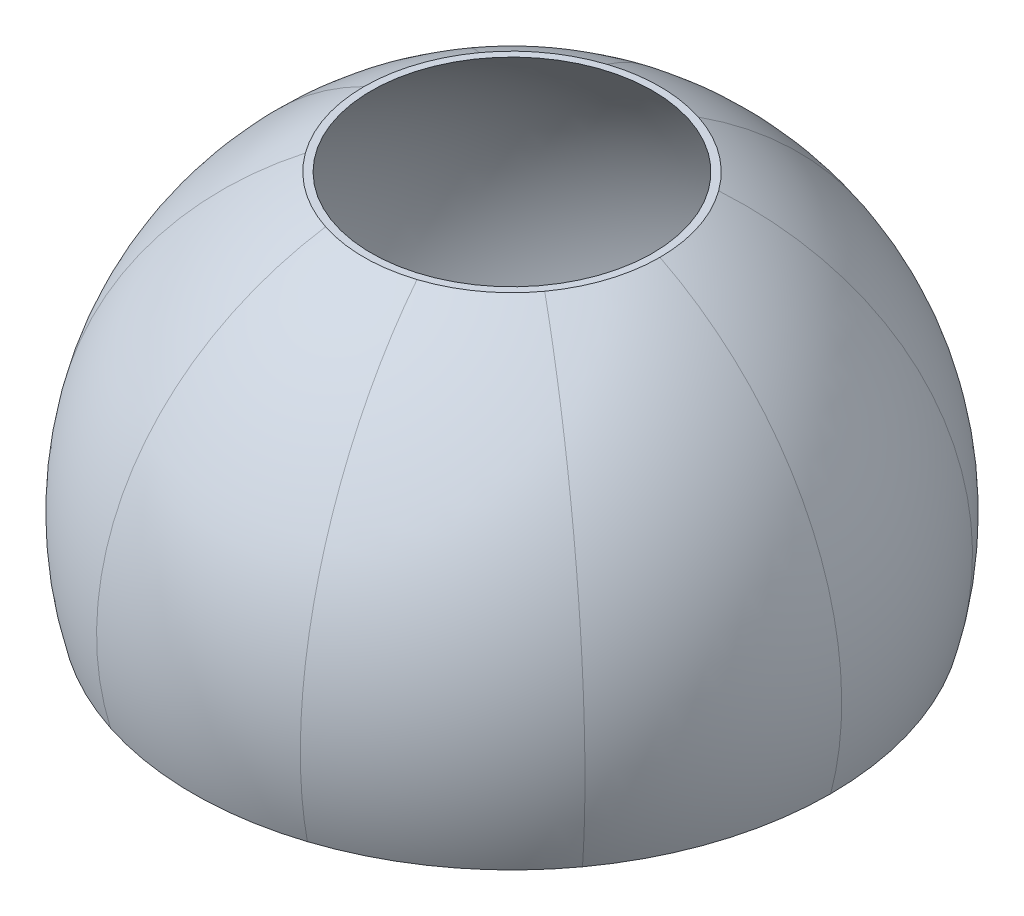
ISO-10303-21;
HEADER;
FILE_DESCRIPTION(('STEP AP214'),'2;1');
FILE_NAME('part.step','',(''),(''),'','','');
FILE_SCHEMA(('AUTOMOTIVE_DESIGN { 1 0 10303 214 1 1 1 1 }'));
ENDSEC;
DATA;
#1=APPLICATION_CONTEXT('core data for automotive mechanical design processes');
#2=APPLICATION_PROTOCOL_DEFINITION('international standard','automotive_design',2000,#1);
#3=PRODUCT_CONTEXT('',#1,'mechanical');
#4=PRODUCT('Part','Part','',(#3));
#5=PRODUCT_RELATED_PRODUCT_CATEGORY('part','',(#4));
#6=PRODUCT_DEFINITION_FORMATION('','',#4);
#7=PRODUCT_DEFINITION_CONTEXT('part definition',#1,'design');
#8=PRODUCT_DEFINITION('design','',#6,#7);
#9=PRODUCT_DEFINITION_SHAPE('','',#8);
#10=(LENGTH_UNIT() NAMED_UNIT(*) SI_UNIT(.MILLI.,.METRE.));
#11=(NAMED_UNIT(*) PLANE_ANGLE_UNIT() SI_UNIT($,.RADIAN.));
#12=(NAMED_UNIT(*) SI_UNIT($,.STERADIAN.) SOLID_ANGLE_UNIT());
#13=UNCERTAINTY_MEASURE_WITH_UNIT(LENGTH_MEASURE(1.E-05),#10,'distance_accuracy_value','');
#14=(GEOMETRIC_REPRESENTATION_CONTEXT(3) GLOBAL_UNCERTAINTY_ASSIGNED_CONTEXT((#13)) GLOBAL_UNIT_ASSIGNED_CONTEXT((#10,
#11,#12)) REPRESENTATION_CONTEXT('',''));
#15=CARTESIAN_POINT('',(0.,0.,0.));
#16=DIRECTION('',(0.,0.,1.));
#17=DIRECTION('',(1.,0.,0.));
#18=AXIS2_PLACEMENT_3D('',#15,#16,#17);
#19=CARTESIAN_POINT('',(-218.439545324779,67.4076923076924,0.));
#20=DIRECTION('',(0.,-1.,0.));
#21=DIRECTION('',(0.809016994374947,0.,-0.587785252292474));
#22=AXIS2_PLACEMENT_3D('',#19,#20,#21);
#23=SPHERICAL_SURFACE('',#22,262.792307692308);
#24=CARTESIAN_POINT('',(-218.439545324779,0.,0.));
#25=DIRECTION('',(0.,-1.,0.));
#26=DIRECTION('',(0.,0.,-1.));
#27=AXIS2_PLACEMENT_3D('',#24,#25,#26);
#28=CIRCLE('',#27,254.);
#29=CARTESIAN_POINT('',(-12.9492287535408,0.,-149.297454082285));
#30=VERTEX_POINT('',#29);
#31=CARTESIAN_POINT('',(35.5604546752205,0.,0.));
#32=VERTEX_POINT('',#31);
#33=EDGE_CURVE('E125',#30,#32,#28,.T.);
#34=ORIENTED_EDGE('',*,*,#33,.F.);
#35=CARTESIAN_POINT('',(-218.439545324779,67.4076923076924,0.));
#36=DIRECTION('',(-0.587785252292463,0.,-0.809016994374955));
#37=DIRECTION('',(-0.809016994374955,0.,0.587785252292463));
#38=AXIS2_PLACEMENT_3D('',#35,#36,#37);
#39=CIRCLE('',#38,262.792307692308);
#40=CARTESIAN_POINT('',(-123.043471694853,302.26,-69.3093044968701));
#41=VERTEX_POINT('',#40);
#42=EDGE_CURVE('E12',#30,#41,#39,.F.);
#43=ORIENTED_EDGE('',*,*,#42,.T.);
#44=CARTESIAN_POINT('',(-218.439545324779,302.26,0.));
#45=DIRECTION('',(0.,1.,0.));
#46=DIRECTION('',(0.,0.,1.));
#47=AXIS2_PLACEMENT_3D('',#44,#45,#46);
#48=CIRCLE('',#47,117.916031793163);
#49=CARTESIAN_POINT('',(-100.523513531617,302.26,0.));
#50=VERTEX_POINT('',#49);
#51=EDGE_CURVE('E138',#41,#50,#48,.F.);
#52=ORIENTED_EDGE('',*,*,#51,.T.);
#53=CARTESIAN_POINT('',(-218.439545324779,67.4076923076924,0.));
#54=DIRECTION('',(0.,0.,-1.));
#55=DIRECTION('',(-1.,0.,0.));
#56=AXIS2_PLACEMENT_3D('',#53,#54,#55);
#57=CIRCLE('',#56,262.792307692308);
#58=EDGE_CURVE('E137',#32,#50,#57,.F.);
#59=ORIENTED_EDGE('',*,*,#58,.F.);
#60=EDGE_LOOP('',(#34,#43,#52,#59));
#61=FACE_BOUND('',#60,.T.);
#62=ADVANCED_FACE('F50',(#61),#23,.T.);
#63=ORIENTED_EDGE('',*,*,#42,.F.);
#64=CARTESIAN_POINT('',(-139.94922875354,0.,-241.568355138968));
#65=VERTEX_POINT('',#64);
#66=EDGE_CURVE('E132',#65,#30,#28,.T.);
#67=ORIENTED_EDGE('',*,*,#66,.F.);
#68=CARTESIAN_POINT('',(-218.439545324779,67.4076923076924,1.26808024327473E-13));
#69=DIRECTION('',(-0.95105651629515,0.,-0.309016994374958));
#70=DIRECTION('',(-0.309016994374958,0.,0.95105651629515));
#71=AXIS2_PLACEMENT_3D('',#68,#69,#70);
#72=CIRCLE('',#71,262.792307692308);
#73=CARTESIAN_POINT('',(-182.001487591434,302.26,-112.144810412553));
#74=VERTEX_POINT('',#73);
#75=EDGE_CURVE('E59',#65,#74,#72,.F.);
#76=ORIENTED_EDGE('',*,*,#75,.T.);
#77=EDGE_CURVE('E181',#74,#41,#48,.F.);
#78=ORIENTED_EDGE('',*,*,#77,.T.);
#79=EDGE_LOOP('',(#63,#67,#76,#78));
#80=FACE_BOUND('',#79,.T.);
#81=ADVANCED_FACE('F180',(#80),#23,.T.);
#82=ORIENTED_EDGE('',*,*,#75,.F.);
#83=CARTESIAN_POINT('',(-296.929861896013,0.,-241.56835513897));
#84=VERTEX_POINT('',#83);
#85=EDGE_CURVE('E237',#84,#65,#28,.T.);
#86=ORIENTED_EDGE('',*,*,#85,.F.);
#87=CARTESIAN_POINT('',(-218.439545324779,67.4076923076924,-2.48659351443889E-13));
#88=DIRECTION('',(-0.951056516295157,0.,0.309016994374938));
#89=DIRECTION('',(0.309016994374938,0.,0.951056516295157));
#90=AXIS2_PLACEMENT_3D('',#87,#88,#89);
#91=CIRCLE('',#90,262.792307692308);
#92=CARTESIAN_POINT('',(-254.877603058122,302.26,-112.144810412554));
#93=VERTEX_POINT('',#92);
#94=EDGE_CURVE('E175',#84,#93,#91,.F.);
#95=ORIENTED_EDGE('',*,*,#94,.T.);
#96=EDGE_CURVE('E190',#93,#74,#48,.F.);
#97=ORIENTED_EDGE('',*,*,#96,.T.);
#98=EDGE_LOOP('',(#82,#86,#95,#97));
#99=FACE_BOUND('',#98,.T.);
#100=ADVANCED_FACE('F193',(#99),#23,.T.);
#101=ORIENTED_EDGE('',*,*,#94,.F.);
#102=CARTESIAN_POINT('',(-423.929861896014,0.,-149.297454082291));
#103=VERTEX_POINT('',#102);
#104=EDGE_CURVE('E233',#103,#84,#28,.T.);
#105=ORIENTED_EDGE('',*,*,#104,.F.);
#106=CARTESIAN_POINT('',(-218.439545324779,67.4076923076924,-8.60883758134551E-13));
#107=DIRECTION('',(-0.58778525229248,0.,0.809016994374942));
#108=DIRECTION('',(0.809016994374942,0.,0.58778525229248));
#109=AXIS2_PLACEMENT_3D('',#106,#107,#108);
#110=CIRCLE('',#109,262.792307692308);
#111=CARTESIAN_POINT('',(-313.835618954704,302.26,-69.3093044968722));
#112=VERTEX_POINT('',#111);
#113=EDGE_CURVE('E172',#103,#112,#110,.F.);
#114=ORIENTED_EDGE('',*,*,#113,.T.);
#115=EDGE_CURVE('E195',#112,#93,#48,.F.);
#116=ORIENTED_EDGE('',*,*,#115,.T.);
#117=EDGE_LOOP('',(#101,#105,#114,#116));
#118=FACE_BOUND('',#117,.T.);
#119=ADVANCED_FACE('F231',(#118),#23,.T.);
#120=ORIENTED_EDGE('',*,*,#113,.F.);
#121=CARTESIAN_POINT('',(-472.439545324779,0.,-1.55089722650756E-12));
#122=VERTEX_POINT('',#121);
#123=EDGE_CURVE('E236',#122,#103,#28,.T.);
#124=ORIENTED_EDGE('',*,*,#123,.F.);
#125=CARTESIAN_POINT('',(-218.439545324779,67.4076923076924,-1.24569825608558E-12));
#126=DIRECTION('',(0.,0.,1.));
#127=DIRECTION('',(0.,-1.,0.));
#128=AXIS2_PLACEMENT_3D('',#125,#126,#127);
#129=CIRCLE('',#128,262.792307692308);
#130=CARTESIAN_POINT('',(-336.355577117942,302.26,0.));
#131=VERTEX_POINT('',#130);
#132=EDGE_CURVE('E169',#122,#131,#129,.F.);
#133=ORIENTED_EDGE('',*,*,#132,.T.);
#134=EDGE_CURVE('E197',#131,#112,#48,.F.);
#135=ORIENTED_EDGE('',*,*,#134,.T.);
#136=EDGE_LOOP('',(#120,#124,#133,#135));
#137=FACE_BOUND('',#136,.T.);
#138=ADVANCED_FACE('F227',(#137),#23,.T.);
#139=ORIENTED_EDGE('',*,*,#132,.F.);
#140=CARTESIAN_POINT('',(-423.929861896018,0.,149.297454082286));
#141=VERTEX_POINT('',#140);
#142=EDGE_CURVE('E241',#141,#122,#28,.T.);
#143=ORIENTED_EDGE('',*,*,#142,.F.);
#144=CARTESIAN_POINT('',(-218.43954532478,67.4076923076924,-9.40075121292865E-13));
#145=DIRECTION('',(0.587785252292469,0.,0.809016994374951));
#146=DIRECTION('',(0.809016994374951,0.,-0.587785252292469));
#147=AXIS2_PLACEMENT_3D('',#144,#145,#146);
#148=CIRCLE('',#147,262.792307692308);
#149=CARTESIAN_POINT('',(-313.835618954705,302.26,69.3093044968708));
#150=VERTEX_POINT('',#149);
#151=EDGE_CURVE('E166',#141,#150,#148,.F.);
#152=ORIENTED_EDGE('',*,*,#151,.T.);
#153=EDGE_CURVE('E216',#150,#131,#48,.F.);
#154=ORIENTED_EDGE('',*,*,#153,.T.);
#155=EDGE_LOOP('',(#139,#143,#152,#154));
#156=FACE_BOUND('',#155,.T.);
#157=ADVANCED_FACE('F252',(#156),#23,.T.);
#158=ORIENTED_EDGE('',*,*,#151,.F.);
#159=CARTESIAN_POINT('',(-296.929861896018,0.,241.568355138968));
#160=VERTEX_POINT('',#159);
#161=EDGE_CURVE('E244',#160,#141,#28,.T.);
#162=ORIENTED_EDGE('',*,*,#161,.F.);
#163=CARTESIAN_POINT('',(-218.43954532478,67.4076923076924,-2.73130828467535E-13));
#164=DIRECTION('',(0.951056516295152,0.,0.309016994374951));
#165=DIRECTION('',(0.309016994374951,0.,-0.951056516295152));
#166=AXIS2_PLACEMENT_3D('',#163,#164,#165);
#167=CIRCLE('',#166,262.792307692308);
#168=CARTESIAN_POINT('',(-254.877603058124,302.26,112.144810412554));
#169=VERTEX_POINT('',#168);
#170=EDGE_CURVE('E163',#160,#169,#167,.F.);
#171=ORIENTED_EDGE('',*,*,#170,.T.);
#172=EDGE_CURVE('E211',#169,#150,#48,.F.);
#173=ORIENTED_EDGE('',*,*,#172,.T.);
#174=EDGE_LOOP('',(#158,#162,#171,#173));
#175=FACE_BOUND('',#174,.T.);
#176=ADVANCED_FACE('F251',(#175),#23,.T.);
#177=ORIENTED_EDGE('',*,*,#170,.F.);
#178=CARTESIAN_POINT('',(-139.949228753544,0.,241.568355138969));
#179=VERTEX_POINT('',#178);
#180=EDGE_CURVE('E150',#179,#160,#28,.T.);
#181=ORIENTED_EDGE('',*,*,#180,.F.);
#182=CARTESIAN_POINT('',(-218.43954532478,67.4076923076924,1.5943666035898E-13));
#183=DIRECTION('',(0.951056516295154,0.,-0.309016994374945));
#184=DIRECTION('',(-0.309016994374945,0.,-0.951056516295154));
#185=AXIS2_PLACEMENT_3D('',#182,#183,#184);
#186=CIRCLE('',#185,262.792307692308);
#187=CARTESIAN_POINT('',(-182.001487591436,302.26,112.144810412554));
#188=VERTEX_POINT('',#187);
#189=EDGE_CURVE('E160',#179,#188,#186,.F.);
#190=ORIENTED_EDGE('',*,*,#189,.T.);
#191=EDGE_CURVE('E205',#188,#169,#48,.F.);
#192=ORIENTED_EDGE('',*,*,#191,.T.);
#193=EDGE_LOOP('',(#177,#181,#190,#192));
#194=FACE_BOUND('',#193,.T.);
#195=ADVANCED_FACE('F250',(#194),#23,.T.);
#196=ORIENTED_EDGE('',*,*,#189,.F.);
#197=CARTESIAN_POINT('',(-12.9492287535431,0.,149.297454082289));
#198=VERTEX_POINT('',#197);
#199=EDGE_CURVE('E148',#198,#179,#28,.T.);
#200=ORIENTED_EDGE('',*,*,#199,.F.);
#201=CARTESIAN_POINT('',(-218.43954532478,67.4076923076924,1.47605139582542E-13));
#202=DIRECTION('',(0.587785252292474,0.,-0.809016994374947));
#203=DIRECTION('',(-0.809016994374947,0.,-0.587785252292474));
#204=AXIS2_PLACEMENT_3D('',#201,#202,#203);
#205=CIRCLE('',#204,262.792307692308);
#206=CARTESIAN_POINT('',(-123.043471694854,302.26,69.3093044968716));
#207=VERTEX_POINT('',#206);
#208=EDGE_CURVE('E143',#198,#207,#205,.F.);
#209=ORIENTED_EDGE('',*,*,#208,.T.);
#210=EDGE_CURVE('E200',#207,#188,#48,.F.);
#211=ORIENTED_EDGE('',*,*,#210,.T.);
#212=EDGE_LOOP('',(#196,#200,#209,#211));
#213=FACE_BOUND('',#212,.T.);
#214=ADVANCED_FACE('F267',(#213),#23,.T.);
#215=ORIENTED_EDGE('',*,*,#208,.F.);
#216=EDGE_CURVE('E130',#32,#198,#28,.T.);
#217=ORIENTED_EDGE('',*,*,#216,.F.);
#218=ORIENTED_EDGE('',*,*,#58,.T.);
#219=EDGE_CURVE('E198',#50,#207,#48,.F.);
#220=ORIENTED_EDGE('',*,*,#219,.T.);
#221=EDGE_LOOP('',(#215,#217,#218,#220));
#222=FACE_BOUND('',#221,.T.);
#223=ADVANCED_FACE('F145',(#222),#23,.T.);
#224=CARTESIAN_POINT('',(-218.439545324779,67.4076923076924,0.));
#225=DIRECTION('',(0.,-1.,0.));
#226=DIRECTION('',(0.809016994374947,0.,-0.587785252292474));
#227=AXIS2_PLACEMENT_3D('',#224,#225,#226);
#228=SPHERICAL_SURFACE('',#227,260.252307692308);
#229=CARTESIAN_POINT('',(-218.439545324779,0.65152416356884,0.));
#230=DIRECTION('',(0.,-1.,0.));
#231=DIRECTION('',(0.,0.,-1.));
#232=AXIS2_PLACEMENT_3D('',#229,#230,#231);
#233=CIRCLE('',#232,251.544981412639);
#234=CARTESIAN_POINT('',(-14.9353805122241,0.651524163568853,-147.854430362534));
#235=VERTEX_POINT('',#234);
#236=EDGE_CURVE('E134',#235,#235,#233,.T.);
#237=CARTESIAN_POINT('',(-218.439545324779,302.26,0.));
#238=DIRECTION('',(0.,1.,0.));
#239=DIRECTION('',(0.,0.,1.));
#240=AXIS2_PLACEMENT_3D('',#237,#238,#239);
#241=CIRCLE('',#240,112.1412378689);
#242=CARTESIAN_POINT('',(-127.715378118596,302.26,-65.9149657931619));
#243=VERTEX_POINT('',#242);
#244=EDGE_CURVE('E154',#243,#243,#241,.T.);
#245=CARTESIAN_POINT('',(-14.9353805122241,0.651524163568853,-147.854430362534));
#246=CARTESIAN_POINT('',(-14.5458763599623,2.4656838809583,-148.137421693987));
#247=CARTESIAN_POINT('',(-14.1722550689978,4.28505357539465,-148.408873451241));
#248=CARTESIAN_POINT('',(-13.4569413169842,7.93335772644308,-148.928579312946));
#249=CARTESIAN_POINT('',(-13.1152488559351,9.76229218305516,-149.176833417397));
#250=CARTESIAN_POINT('',(-12.4639558710734,13.428870666537,-149.65002546909));
#251=CARTESIAN_POINT('',(-12.1543553472607,15.2665146934068,-149.874963416333));
#252=CARTESIAN_POINT('',(-11.5673903169108,18.9496518487711,-150.301418473334));
#253=CARTESIAN_POINT('',(-11.2900258103736,20.7951449772656,-150.502935583093));
#254=CARTESIAN_POINT('',(-10.767662877773,24.4931165144807,-150.882454468681));
#255=CARTESIAN_POINT('',(-10.5226644517096,26.3455949232014,-151.06045624451));
#256=CARTESIAN_POINT('',(-10.0651483049155,30.056669843473,-151.392861182405));
#257=CARTESIAN_POINT('',(-9.85263058418486,31.915266355024,-151.547264344471));
#258=CARTESIAN_POINT('',(-9.46017534549441,35.63770746271,-151.832399765718));
#259=CARTESIAN_POINT('',(-9.28023782753463,37.501552058845,-151.963132024899));
#260=CARTESIAN_POINT('',(-8.95302722014034,41.2336168546002,-152.200864446786));
#261=CARTESIAN_POINT('',(-8.80575413070581,43.1018370542203,-152.307864609491));
#262=CARTESIAN_POINT('',(-8.54394132118116,46.8417785292509,-152.498082749987));
#263=CARTESIAN_POINT('',(-8.42940160109103,48.7134998046613,-152.581300727778));
#264=CARTESIAN_POINT('',(-8.23310914685364,52.4595672642532,-152.723915543708));
#265=CARTESIAN_POINT('',(-8.15135641270639,54.3339134484348,-152.783312381847));
#266=CARTESIAN_POINT('',(-8.02067619951355,58.0843533299293,-152.8782571143));
#267=CARTESIAN_POINT('',(-7.97174872046797,59.9604470272422,-152.913805008615));
#268=CARTESIAN_POINT('',(-7.9067419207801,63.7135037213036,-152.961035213198));
#269=CARTESIAN_POINT('',(-7.89066260013781,65.5904667180521,-152.972717523466));
#270=CARTESIAN_POINT('',(-7.89135964411442,69.3443833903716,-152.972211091373));
#271=CARTESIAN_POINT('',(-7.90813600873332,71.2213370659427,-152.960022349012));
#272=CARTESIAN_POINT('',(-7.97453657008727,74.9743564796556,-152.911779517305));
#273=CARTESIAN_POINT('',(-8.02416076682231,76.8504222177973,-152.875725427959));
#274=CARTESIAN_POINT('',(-8.15623376294601,80.6007875560504,-152.779768779474));
#275=CARTESIAN_POINT('',(-8.23868256233466,82.4750871561618,-152.719866220335));
#276=CARTESIAN_POINT('',(-8.43636616885719,86.2210428444956,-152.576240673107));
#277=CARTESIAN_POINT('',(-8.55160097599108,88.0926989327179,-152.492517685018));
#278=CARTESIAN_POINT('',(-8.81480265571686,91.832491460863,-152.301290471254));
#279=CARTESIAN_POINT('',(-8.96276952830875,93.7006279007858,-152.19378624558));
#280=CARTESIAN_POINT('',(-9.29136607453519,97.4325066434951,-151.955046880191));
#281=CARTESIAN_POINT('',(-9.47199574816973,99.2962489462817,-151.823811740476));
#282=CARTESIAN_POINT('',(-9.86583334236132,103.018466982811,-151.537671979169));
#283=CARTESIAN_POINT('',(-10.0790412629184,104.876942716554,-151.382767357576));
#284=CARTESIAN_POINT('',(-10.5379355467102,108.587757648409,-151.049361144543));
#285=CARTESIAN_POINT('',(-10.7836219099449,110.440096846521,-150.870859553102));
#286=CARTESIAN_POINT('',(-11.3073580714421,114.137771613087,-150.49034295832));
#287=CARTESIAN_POINT('',(-11.5854078697045,115.983107181541,-150.288327954979));
#288=CARTESIAN_POINT('',(-12.1737407440377,119.665910873215,-149.860879101152));
#289=CARTESIAN_POINT('',(-12.4840238201084,121.503378996435,-149.635445250667));
#290=CARTESIAN_POINT('',(-13.1366780041967,125.169587664875,-149.161264229846));
#291=CARTESIAN_POINT('',(-13.4790491122143,126.998328210096,-148.912517059511));
#292=CARTESIAN_POINT('',(-14.1957190936841,130.646225675219,-148.391825839428));
#293=CARTESIAN_POINT('',(-14.5700179671363,132.465382595122,-148.119881789681));
#294=CARTESIAN_POINT('',(-15.3503682673337,136.093261248457,-147.552924109845));
#295=CARTESIAN_POINT('',(-15.7564196940788,137.901982981889,-147.257910479758));
#296=CARTESIAN_POINT('',(-16.6000850251096,141.508144585922,-146.64495173736));
#297=CARTESIAN_POINT('',(-17.0376989293951,143.305584456522,-146.32700662505));
#298=CARTESIAN_POINT('',(-17.944284365119,146.888340939654,-145.668333750727));
#299=CARTESIAN_POINT('',(-18.4132558965573,148.673657552187,-145.327605988713));
#300=CARTESIAN_POINT('',(-19.3823370574557,152.231331798935,-144.623527312231));
#301=CARTESIAN_POINT('',(-19.8824466869158,154.003689433152,-144.260176397764));
#302=CARTESIAN_POINT('',(-20.9135699387472,157.534616069219,-143.511021503693));
#303=CARTESIAN_POINT('',(-21.4445835611186,159.293185071069,-143.12521752409));
#304=CARTESIAN_POINT('',(-22.5372662272683,162.795711242915,-142.331337097518));
#305=CARTESIAN_POINT('',(-23.0989352710467,164.539668412911,-141.923260650549));
#306=CARTESIAN_POINT('',(-24.2526658584711,168.01215456147,-141.085026312924));
#307=CARTESIAN_POINT('',(-24.8447274021171,169.740683540033,-140.654868422269));
#308=CARTESIAN_POINT('',(-26.0589658407777,173.181504168201,-139.772672557443));
#309=CARTESIAN_POINT('',(-26.6811427357922,174.893795817806,-139.320634583273));
#310=CARTESIAN_POINT('',(-27.9553206314663,178.30134025135,-138.394890153821));
#311=CARTESIAN_POINT('',(-28.6073216321259,179.99659303529,-137.92118369854));
#312=CARTESIAN_POINT('',(-29.9408425324764,183.369266176816,-136.952324052451));
#313=CARTESIAN_POINT('',(-30.6223624321675,185.046686534403,-136.457170861644));
#314=CARTESIAN_POINT('',(-32.0146021059468,188.382909610034,-135.445649529467));
#315=CARTESIAN_POINT('',(-32.7253218800352,190.041712328077,-134.929281388097));
#316=CARTESIAN_POINT('',(-34.1756286092926,193.339923626486,-133.87557187064));
#317=CARTESIAN_POINT('',(-34.9152155644615,194.979332206852,-133.338230494551));
#318=CARTESIAN_POINT('',(-36.4229104496169,198.237987810315,-132.24282604123));
#319=CARTESIAN_POINT('',(-37.1910183796033,199.857234833413,-131.684762963996));
#320=CARTESIAN_POINT('',(-38.7553956572458,203.074809340527,-130.548176341944));
#321=CARTESIAN_POINT('',(-39.5516650049018,204.673136824544,-129.969652797125));
#322=CARTESIAN_POINT('',(-41.1719923781626,207.848124064278,-128.79241605116));
#323=CARTESIAN_POINT('',(-41.9960504037672,209.424783819996,-128.193702850014));
#324=CARTESIAN_POINT('',(-43.6715693851133,212.555697556742,-126.976367053586));
#325=CARTESIAN_POINT('',(-44.5230303408547,214.109951537771,-126.357744458303));
#326=CARTESIAN_POINT('',(-46.2529566071428,217.195326167063,-125.100879455531));
#327=CARTESIAN_POINT('',(-47.1314219176896,218.726446815326,-124.462637048042));
#328=CARTESIAN_POINT('',(-48.9149456773138,221.764838049898,-123.166831186967));
#329=CARTESIAN_POINT('',(-49.8200041263912,223.272108636207,-122.509267733381));
#330=CARTESIAN_POINT('',(-51.6562904983523,226.262094182077,-121.175127590555));
#331=CARTESIAN_POINT('',(-52.5875184212359,227.744809141639,-120.498550901314));
#332=CARTESIAN_POINT('',(-54.4757078259557,230.684989363896,-119.126700997856));
#333=CARTESIAN_POINT('',(-55.4326693077919,232.142454626591,-118.431427783639));
#334=CARTESIAN_POINT('',(-57.3718778694889,235.031453204572,-117.022510292894));
#335=CARTESIAN_POINT('',(-58.3541249493498,236.462986519858,-116.308866016366));
#336=CARTESIAN_POINT('',(-60.3434449097884,239.299451091417,-114.863540463297));
#337=CARTESIAN_POINT('',(-61.350517790366,240.704382347691,-114.131859186757));
#338=CARTESIAN_POINT('',(-63.3890179337843,243.48698514225,-112.650802139218));
#339=CARTESIAN_POINT('',(-64.420445196625,244.864656680534,-111.90142636822));
#340=CARTESIAN_POINT('',(-66.5071712856448,247.592095140619,-110.385331120249));
#341=CARTESIAN_POINT('',(-67.562470111824,248.941862062418,-109.618611643276));
#342=CARTESIAN_POINT('',(-69.6964453341361,251.612859453399,-108.068187890557));
#343=CARTESIAN_POINT('',(-70.7751217302691,252.93408992258,-107.28448361481));
#344=CARTESIAN_POINT('',(-72.9553471558867,255.54739593032,-105.700457122461));
#345=CARTESIAN_POINT('',(-74.0568961853712,256.839471468879,-104.900134905857));
#346=CARTESIAN_POINT('',(-76.2823512342365,259.393862785014,-103.283247168692));
#347=CARTESIAN_POINT('',(-77.4062572536171,260.656178562591,-102.466681648131));
#348=CARTESIAN_POINT('',(-79.6759001733423,263.150459457175,-100.817689543564));
#349=CARTESIAN_POINT('',(-80.8216370736869,264.382424574181,-99.9852629595589));
#350=CARTESIAN_POINT('',(-83.1344054272076,266.815427455405,-98.3049383933012));
#351=CARTESIAN_POINT('',(-84.3014368803838,268.016465219623,-97.4570404110488));
#352=CARTESIAN_POINT('',(-86.6562480432904,270.387051180392,-95.7461699557754));
#353=CARTESIAN_POINT('',(-87.8440277530208,271.556599376942,-94.8831974827544));
#354=CARTESIAN_POINT('',(-90.2397794203552,273.863658727968,-93.1425820098961));
#355=CARTESIAN_POINT('',(-91.4477513779592,275.001169882444,-92.2649390100589));
#356=CARTESIAN_POINT('',(-93.8833220801668,277.243622671817,-90.4953933149412));
#357=CARTESIAN_POINT('',(-95.1109208247703,278.348564306714,-89.6034906196608));
#358=CARTESIAN_POINT('',(-97.5851704528387,280.525360825014,-87.8058430399676));
#359=CARTESIAN_POINT('',(-98.8318213363037,281.597215708418,-86.9000981555549));
#360=CARTESIAN_POINT('',(-101.34359167482,283.707336981657,-85.0751901840407));
#361=CARTESIAN_POINT('',(-102.60871112987,284.745603371494,-84.1560270969393));
#362=CARTESIAN_POINT('',(-105.156826401567,286.788061632273,-82.3047129857916));
#363=CARTESIAN_POINT('',(-106.439822218213,287.792253503217,-81.3725619617454));
#364=CARTESIAN_POINT('',(-109.023089625483,289.766092674868,-79.4957083291536));
#365=CARTESIAN_POINT('',(-110.323361216107,290.735739975577,-78.551005720608));
#366=CARTESIAN_POINT('',(-112.940571532495,292.6400360385,-76.649491121018));
#367=CARTESIAN_POINT('',(-114.257510258258,293.574684800716,-75.6926791299737));
#368=CARTESIAN_POINT('',(-116.907438270844,295.408546527998,-73.7673937326773));
#369=CARTESIAN_POINT('',(-118.240427557667,296.307759493064,-72.7989203264251));
#370=CARTESIAN_POINT('',(-120.921833102118,298.070327736568,-70.8507651635522));
#371=CARTESIAN_POINT('',(-122.270249359746,298.933683015005,-69.8710834069314));
#372=CARTESIAN_POINT('',(-124.981876178437,300.624135328863,-67.9009712030721));
#373=CARTESIAN_POINT('',(-126.345086739501,301.451232364283,-66.9105407558337));
#374=CARTESIAN_POINT('',(-127.715378118596,302.26,-65.9149657931619));
#375=B_SPLINE_CURVE_WITH_KNOTS('',3,(#245,#246,#247,#248,#249,#250,#251,#252,#253,#254,#255,
#256,#257,#258,#259,#260,#261,#262,#263,#264,#265,#266,#267,#268,#269,#270,#271,#272,#273,#274,
#275,#276,#277,#278,#279,#280,#281,#282,#283,#284,#285,#286,#287,#288,#289,#290,#291,#292,#293,
#294,#295,#296,#297,#298,#299,#300,#301,#302,#303,#304,#305,#306,#307,#308,#309,#310,#311,#312,
#313,#314,#315,#316,#317,#318,#319,#320,#321,#322,#323,#324,#325,#326,#327,#328,#329,#330,#331,
#332,#333,#334,#335,#336,#337,#338,#339,#340,#341,#342,#343,#344,#345,#346,#347,#348,#349,#350,
#351,#352,#353,#354,#355,#356,#357,#358,#359,#360,#361,#362,#363,#364,#365,#366,#367,#368,#369,
#370,#371,#372,#373,#374),.UNSPECIFIED.,.F.,.F.,(4,2,2,2,2,2,2,2,2,2,2,2,2,2,2,2,2,2,2,2,2,2,2,
2,2,2,2,2,2,2,2,2,2,2,2,2,2,2,2,2,2,2,2,2,2,2,2,2,2,2,2,2,2,2,2,2,2,2,2,2,2,2,2,2,4),(0.,
5.63076533270023,11.2615306654005,16.8922959981007,22.5230613308009,28.1538266635012,
33.7845919962014,39.4153573289016,45.0461226616019,50.6768879943021,56.3076533270023,
61.9384186597026,67.5691839924028,73.199949325103,78.8307146578033,84.4614799905035,
90.0922453232038,95.723010655904,101.353775988604,106.984541321304,112.615306654005,
118.246071986705,123.876837319405,129.507602652105,135.138367984806,140.769133317506,
146.399898650206,152.030663982906,157.661429315607,163.292194648307,168.922959981007,
174.553725313707,180.184490646407,185.815255979108,191.446021311808,197.076786644508,
202.707551977208,208.338317309909,213.969082642609,219.599847975309,225.230613308009,
230.86137864071,236.49214397341,242.12290930611,247.75367463881,253.38443997151,
259.015205304211,264.645970636911,270.276735969611,275.907501302311,281.538266635012,
287.169031967712,292.799797300412,298.430562633112,304.061327965813,309.692093298513,
315.322858631213,320.953623963913,326.584389296613,332.215154629314,337.845919962014,
343.476685294714,349.107450627414,354.738215960115,360.368981292815),.UNSPECIFIED.);
#376=EDGE_CURVE('BSEAM266',#235,#243,#375,.T.);
#377=ORIENTED_EDGE('',*,*,#236,.T.);
#378=ORIENTED_EDGE('',*,*,#244,.T.);
#379=ORIENTED_EDGE('',*,*,#376,.T.);
#380=ORIENTED_EDGE('',*,*,#376,.F.);
#381=EDGE_LOOP('',(#377,#379,#378,#380));
#382=FACE_BOUND('',#381,.T.);
#383=ADVANCED_FACE('F266',(#382),#228,.F.);
#384=CARTESIAN_POINT('',(-218.439545324779,0.65152416356884,0.));
#385=DIRECTION('',(0.,-1.,0.));
#386=DIRECTION('',(0.,0.,-1.));
#387=AXIS2_PLACEMENT_3D('',#384,#385,#386);
#388=CONICAL_SURFACE('',#387,251.544981412639,1.31139125248305);
#389=ORIENTED_EDGE('',*,*,#216,.T.);
#390=ORIENTED_EDGE('',*,*,#199,.T.);
#391=ORIENTED_EDGE('',*,*,#180,.T.);
#392=ORIENTED_EDGE('',*,*,#161,.T.);
#393=ORIENTED_EDGE('',*,*,#142,.T.);
#394=ORIENTED_EDGE('',*,*,#123,.T.);
#395=ORIENTED_EDGE('',*,*,#104,.T.);
#396=ORIENTED_EDGE('',*,*,#85,.T.);
#397=ORIENTED_EDGE('',*,*,#66,.T.);
#398=ORIENTED_EDGE('',*,*,#33,.T.);
#399=EDGE_LOOP('',(#389,#390,#391,#392,#393,#394,#395,#396,#397,#398));
#400=FACE_BOUND('',#399,.T.);
#401=ORIENTED_EDGE('',*,*,#236,.F.);
#402=EDGE_LOOP('',(#401));
#403=FACE_BOUND('',#402,.T.);
#404=ADVANCED_FACE('F52',(#400,#403),#388,.F.);
#405=CARTESIAN_POINT('',(0.,302.26,0.));
#406=DIRECTION('',(0.,1.,0.));
#407=DIRECTION('',(0.,0.,1.));
#408=AXIS2_PLACEMENT_3D('',#405,#406,#407);
#409=PLANE('',#408);
#410=ORIENTED_EDGE('',*,*,#219,.F.);
#411=ORIENTED_EDGE('',*,*,#51,.F.);
#412=ORIENTED_EDGE('',*,*,#77,.F.);
#413=ORIENTED_EDGE('',*,*,#96,.F.);
#414=ORIENTED_EDGE('',*,*,#115,.F.);
#415=ORIENTED_EDGE('',*,*,#134,.F.);
#416=ORIENTED_EDGE('',*,*,#153,.F.);
#417=ORIENTED_EDGE('',*,*,#172,.F.);
#418=ORIENTED_EDGE('',*,*,#191,.F.);
#419=ORIENTED_EDGE('',*,*,#210,.F.);
#420=EDGE_LOOP('',(#410,#411,#412,#413,#414,#415,#416,#417,#418,#419));
#421=FACE_BOUND('',#420,.T.);
#422=ORIENTED_EDGE('',*,*,#244,.F.);
#423=EDGE_LOOP('',(#422));
#424=FACE_BOUND('',#423,.T.);
#425=ADVANCED_FACE('F187',(#421,#424),#409,.T.);
#426=CLOSED_SHELL('',(#62,#81,#100,#119,#138,#157,#176,#195,#214,#223,#383,#404,#425));
#427=MANIFOLD_SOLID_BREP('B2',#426);
#428=ADVANCED_BREP_SHAPE_REPRESENTATION('',(#18,#427),#14);
#429=SHAPE_DEFINITION_REPRESENTATION(#9,#428);
ENDSEC;
END-ISO-10303-21;
